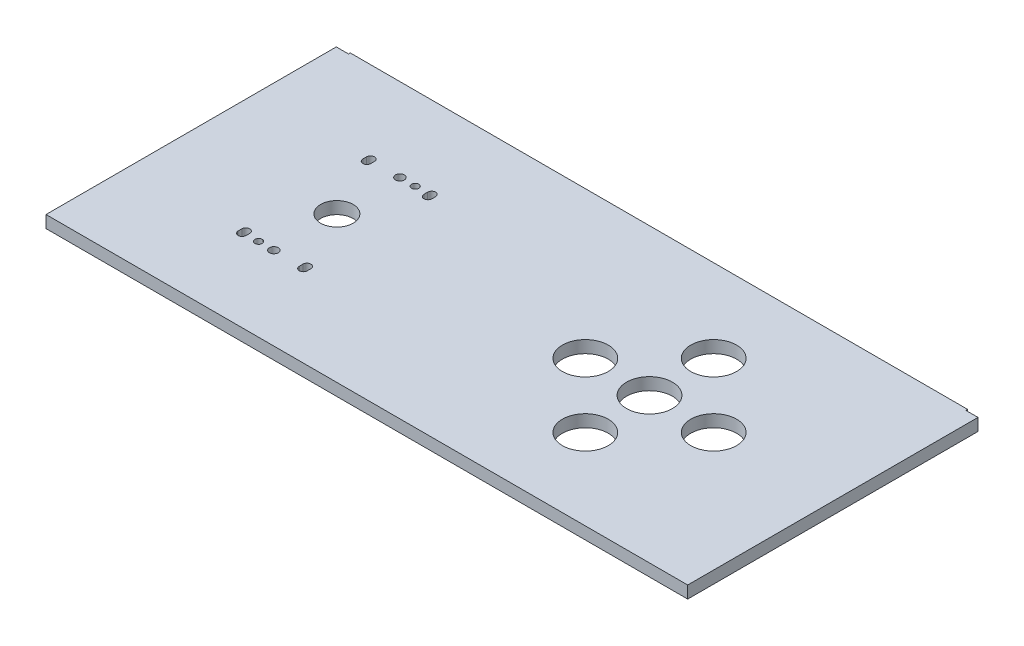
ISO-10303-21;
HEADER;
FILE_DESCRIPTION(('STEP AP214'),'2;1');
FILE_NAME('part.step','',(''),(''),'','','');
FILE_SCHEMA(('AUTOMOTIVE_DESIGN { 1 0 10303 214 1 1 1 1 }'));
ENDSEC;
DATA;
#1=APPLICATION_CONTEXT('core data for automotive mechanical design processes');
#2=APPLICATION_PROTOCOL_DEFINITION('international standard','automotive_design',2000,#1);
#3=PRODUCT_CONTEXT('',#1,'mechanical');
#4=PRODUCT('Part','Part','',(#3));
#5=PRODUCT_RELATED_PRODUCT_CATEGORY('part','',(#4));
#6=PRODUCT_DEFINITION_FORMATION('','',#4);
#7=PRODUCT_DEFINITION_CONTEXT('part definition',#1,'design');
#8=PRODUCT_DEFINITION('design','',#6,#7);
#9=PRODUCT_DEFINITION_SHAPE('','',#8);
#10=(LENGTH_UNIT() NAMED_UNIT(*) SI_UNIT(.MILLI.,.METRE.));
#11=(NAMED_UNIT(*) PLANE_ANGLE_UNIT() SI_UNIT($,.RADIAN.));
#12=(NAMED_UNIT(*) SI_UNIT($,.STERADIAN.) SOLID_ANGLE_UNIT());
#13=UNCERTAINTY_MEASURE_WITH_UNIT(LENGTH_MEASURE(1.E-05),#10,'distance_accuracy_value','');
#14=(GEOMETRIC_REPRESENTATION_CONTEXT(3) GLOBAL_UNCERTAINTY_ASSIGNED_CONTEXT((#13)) GLOBAL_UNIT_ASSIGNED_CONTEXT((#10,
#11,#12)) REPRESENTATION_CONTEXT('',''));
#15=CARTESIAN_POINT('',(0.,0.,0.));
#16=DIRECTION('',(0.,0.,1.));
#17=DIRECTION('',(1.,0.,0.));
#18=AXIS2_PLACEMENT_3D('',#15,#16,#17);
#19=CARTESIAN_POINT('',(114.80943427695,8.,-137.577360592451));
#20=DIRECTION('',(0.,-1.,0.));
#21=DIRECTION('',(0.,0.,-1.));
#22=AXIS2_PLACEMENT_3D('',#19,#20,#21);
#23=CYLINDRICAL_SURFACE('',#22,2.6);
#24=CARTESIAN_POINT('',(114.80943427695,0.,-137.577360592451));
#25=DIRECTION('',(0.,1.,0.));
#26=DIRECTION('',(0.,0.,1.));
#27=AXIS2_PLACEMENT_3D('',#24,#25,#26);
#28=CIRCLE('',#27,2.6);
#29=CARTESIAN_POINT('',(117.40943427695,0.,-137.577360592451));
#30=VERTEX_POINT('',#29);
#31=CARTESIAN_POINT('',(112.20943427695,0.,-137.577360592451));
#32=VERTEX_POINT('',#31);
#33=EDGE_CURVE('E321',#30,#32,#28,.T.);
#34=ORIENTED_EDGE('',*,*,#33,.F.);
#35=DIRECTION('',(0.,-1.,0.));
#36=VECTOR('',#35,1.);
#37=CARTESIAN_POINT('',(117.40943427695,8.,-137.577360592451));
#38=LINE('',#37,#36);
#39=CARTESIAN_POINT('',(117.40943427695,8.,-137.577360592451));
#40=VERTEX_POINT('',#39);
#41=EDGE_CURVE('E11',#40,#30,#38,.T.);
#42=ORIENTED_EDGE('',*,*,#41,.F.);
#43=CARTESIAN_POINT('',(114.80943427695,8.,-137.577360592451));
#44=DIRECTION('',(0.,1.,0.));
#45=DIRECTION('',(0.,0.,1.));
#46=AXIS2_PLACEMENT_3D('',#43,#44,#45);
#47=CIRCLE('',#46,2.6);
#48=CARTESIAN_POINT('',(112.20943427695,8.,-137.577360592451));
#49=VERTEX_POINT('',#48);
#50=EDGE_CURVE('E226',#40,#49,#47,.T.);
#51=ORIENTED_EDGE('',*,*,#50,.T.);
#52=DIRECTION('',(0.,-1.,0.));
#53=VECTOR('',#52,1.);
#54=CARTESIAN_POINT('',(112.20943427695,8.,-137.577360592451));
#55=LINE('',#54,#53);
#56=EDGE_CURVE('E60',#49,#32,#55,.T.);
#57=ORIENTED_EDGE('',*,*,#56,.T.);
#58=EDGE_LOOP('',(#34,#42,#51,#57));
#59=FACE_BOUND('',#58,.T.);
#60=ADVANCED_FACE('F41',(#59),#23,.F.);
#61=CARTESIAN_POINT('',(117.409434276951,8.,-6.78909673137948E-13));
#62=DIRECTION('',(-1.,0.,0.));
#63=DIRECTION('',(0.,0.,1.));
#64=AXIS2_PLACEMENT_3D('',#61,#62,#63);
#65=PLANE('',#64);
#66=DIRECTION('',(0.,0.,-1.));
#67=VECTOR('',#66,1.);
#68=CARTESIAN_POINT('',(117.409434276951,0.,-6.78909673137948E-13));
#69=LINE('',#68,#67);
#70=CARTESIAN_POINT('',(117.40943427695,0.,-135.177360592451));
#71=VERTEX_POINT('',#70);
#72=EDGE_CURVE('E214',#71,#30,#69,.T.);
#73=ORIENTED_EDGE('',*,*,#72,.F.);
#74=DIRECTION('',(0.,-1.,0.));
#75=VECTOR('',#74,1.);
#76=CARTESIAN_POINT('',(117.40943427695,8.,-135.177360592451));
#77=LINE('',#76,#75);
#78=CARTESIAN_POINT('',(117.40943427695,8.,-135.177360592451));
#79=VERTEX_POINT('',#78);
#80=EDGE_CURVE('E51',#79,#71,#77,.T.);
#81=ORIENTED_EDGE('',*,*,#80,.F.);
#82=DIRECTION('',(0.,0.,-1.));
#83=VECTOR('',#82,1.);
#84=CARTESIAN_POINT('',(117.409434276951,8.,-6.78909673137948E-13));
#85=LINE('',#84,#83);
#86=EDGE_CURVE('E212',#79,#40,#85,.T.);
#87=ORIENTED_EDGE('',*,*,#86,.T.);
#88=ORIENTED_EDGE('',*,*,#41,.T.);
#89=EDGE_LOOP('',(#73,#81,#87,#88));
#90=FACE_BOUND('',#89,.T.);
#91=ADVANCED_FACE('F211',(#90),#65,.T.);
#92=CARTESIAN_POINT('',(114.80943427695,8.,-135.177360592451));
#93=DIRECTION('',(0.,-1.,0.));
#94=DIRECTION('',(0.,0.,-1.));
#95=AXIS2_PLACEMENT_3D('',#92,#93,#94);
#96=CYLINDRICAL_SURFACE('',#95,2.6);
#97=CARTESIAN_POINT('',(114.80943427695,0.,-135.177360592451));
#98=DIRECTION('',(0.,1.,0.));
#99=DIRECTION('',(0.,0.,1.));
#100=AXIS2_PLACEMENT_3D('',#97,#98,#99);
#101=CIRCLE('',#100,2.6);
#102=CARTESIAN_POINT('',(112.20943427695,0.,-135.177360592451));
#103=VERTEX_POINT('',#102);
#104=EDGE_CURVE('E324',#103,#71,#101,.T.);
#105=ORIENTED_EDGE('',*,*,#104,.F.);
#106=DIRECTION('',(0.,-1.,0.));
#107=VECTOR('',#106,1.);
#108=CARTESIAN_POINT('',(112.20943427695,8.,-135.177360592451));
#109=LINE('',#108,#107);
#110=CARTESIAN_POINT('',(112.20943427695,8.,-135.177360592451));
#111=VERTEX_POINT('',#110);
#112=EDGE_CURVE('E133',#111,#103,#109,.T.);
#113=ORIENTED_EDGE('',*,*,#112,.F.);
#114=CARTESIAN_POINT('',(114.80943427695,8.,-135.177360592451));
#115=DIRECTION('',(0.,1.,0.));
#116=DIRECTION('',(0.,0.,1.));
#117=AXIS2_PLACEMENT_3D('',#114,#115,#116);
#118=CIRCLE('',#117,2.6);
#119=EDGE_CURVE('E225',#111,#79,#118,.T.);
#120=ORIENTED_EDGE('',*,*,#119,.T.);
#121=ORIENTED_EDGE('',*,*,#80,.T.);
#122=EDGE_LOOP('',(#105,#113,#120,#121));
#123=FACE_BOUND('',#122,.T.);
#124=ADVANCED_FACE('F228',(#123),#96,.F.);
#125=CARTESIAN_POINT('',(114.80943427695,8.,-55.9773605924511));
#126=DIRECTION('',(0.,-1.,0.));
#127=DIRECTION('',(0.,0.,-1.));
#128=AXIS2_PLACEMENT_3D('',#125,#126,#127);
#129=CYLINDRICAL_SURFACE('',#128,2.6);
#130=CARTESIAN_POINT('',(114.80943427695,0.,-55.9773605924511));
#131=DIRECTION('',(0.,1.,0.));
#132=DIRECTION('',(0.,0.,1.));
#133=AXIS2_PLACEMENT_3D('',#130,#131,#132);
#134=CIRCLE('',#133,2.6);
#135=CARTESIAN_POINT('',(117.40943427695,0.,-55.9773605924511));
#136=VERTEX_POINT('',#135);
#137=CARTESIAN_POINT('',(112.20943427695,0.,-55.9773605924511));
#138=VERTEX_POINT('',#137);
#139=EDGE_CURVE('E309',#136,#138,#134,.T.);
#140=ORIENTED_EDGE('',*,*,#139,.F.);
#141=DIRECTION('',(0.,-1.,0.));
#142=VECTOR('',#141,1.);
#143=CARTESIAN_POINT('',(117.40943427695,8.,-55.9773605924511));
#144=LINE('',#143,#142);
#145=CARTESIAN_POINT('',(117.40943427695,8.,-55.9773605924511));
#146=VERTEX_POINT('',#145);
#147=EDGE_CURVE('E346',#146,#136,#144,.T.);
#148=ORIENTED_EDGE('',*,*,#147,.F.);
#149=CARTESIAN_POINT('',(114.80943427695,8.,-55.9773605924511));
#150=DIRECTION('',(0.,1.,0.));
#151=DIRECTION('',(0.,0.,1.));
#152=AXIS2_PLACEMENT_3D('',#149,#150,#151);
#153=CIRCLE('',#152,2.6);
#154=CARTESIAN_POINT('',(112.20943427695,8.,-55.9773605924511));
#155=VERTEX_POINT('',#154);
#156=EDGE_CURVE('E462',#146,#155,#153,.T.);
#157=ORIENTED_EDGE('',*,*,#156,.T.);
#158=DIRECTION('',(0.,-1.,0.));
#159=VECTOR('',#158,1.);
#160=CARTESIAN_POINT('',(112.20943427695,8.,-55.9773605924511));
#161=LINE('',#160,#159);
#162=EDGE_CURVE('E348',#155,#138,#161,.T.);
#163=ORIENTED_EDGE('',*,*,#162,.T.);
#164=EDGE_LOOP('',(#140,#148,#157,#163));
#165=FACE_BOUND('',#164,.T.);
#166=ADVANCED_FACE('F504',(#165),#129,.F.);
#167=CARTESIAN_POINT('',(117.409434276951,8.,-6.78909673137941E-13));
#168=DIRECTION('',(-1.,0.,0.));
#169=DIRECTION('',(0.,0.,1.));
#170=AXIS2_PLACEMENT_3D('',#167,#168,#169);
#171=PLANE('',#170);
#172=DIRECTION('',(0.,0.,-1.));
#173=VECTOR('',#172,1.);
#174=CARTESIAN_POINT('',(117.409434276951,0.,-6.78909673137941E-13));
#175=LINE('',#174,#173);
#176=CARTESIAN_POINT('',(117.40943427695,0.,-53.5773605924511));
#177=VERTEX_POINT('',#176);
#178=EDGE_CURVE('E312',#177,#136,#175,.T.);
#179=ORIENTED_EDGE('',*,*,#178,.F.);
#180=DIRECTION('',(0.,-1.,0.));
#181=VECTOR('',#180,1.);
#182=CARTESIAN_POINT('',(117.40943427695,8.,-53.5773605924511));
#183=LINE('',#182,#181);
#184=CARTESIAN_POINT('',(117.40943427695,8.,-53.5773605924511));
#185=VERTEX_POINT('',#184);
#186=EDGE_CURVE('E353',#185,#177,#183,.T.);
#187=ORIENTED_EDGE('',*,*,#186,.F.);
#188=DIRECTION('',(0.,0.,-1.));
#189=VECTOR('',#188,1.);
#190=CARTESIAN_POINT('',(117.409434276951,8.,-6.78909673137941E-13));
#191=LINE('',#190,#189);
#192=EDGE_CURVE('E465',#185,#146,#191,.T.);
#193=ORIENTED_EDGE('',*,*,#192,.T.);
#194=ORIENTED_EDGE('',*,*,#147,.T.);
#195=EDGE_LOOP('',(#179,#187,#193,#194));
#196=FACE_BOUND('',#195,.T.);
#197=ADVANCED_FACE('F500',(#196),#171,.T.);
#198=CARTESIAN_POINT('',(114.80943427695,8.,-53.5773605924511));
#199=DIRECTION('',(0.,-1.,0.));
#200=DIRECTION('',(0.,0.,-1.));
#201=AXIS2_PLACEMENT_3D('',#198,#199,#200);
#202=CYLINDRICAL_SURFACE('',#201,2.6);
#203=CARTESIAN_POINT('',(114.80943427695,0.,-53.5773605924511));
#204=DIRECTION('',(0.,1.,0.));
#205=DIRECTION('',(0.,0.,1.));
#206=AXIS2_PLACEMENT_3D('',#203,#204,#205);
#207=CIRCLE('',#206,2.6);
#208=CARTESIAN_POINT('',(112.20943427695,0.,-53.5773605924511));
#209=VERTEX_POINT('',#208);
#210=EDGE_CURVE('E315',#209,#177,#207,.T.);
#211=ORIENTED_EDGE('',*,*,#210,.F.);
#212=DIRECTION('',(0.,-1.,0.));
#213=VECTOR('',#212,1.);
#214=CARTESIAN_POINT('',(112.20943427695,8.,-53.5773605924511));
#215=LINE('',#214,#213);
#216=CARTESIAN_POINT('',(112.20943427695,8.,-53.5773605924511));
#217=VERTEX_POINT('',#216);
#218=EDGE_CURVE('E350',#217,#209,#215,.T.);
#219=ORIENTED_EDGE('',*,*,#218,.F.);
#220=CARTESIAN_POINT('',(114.80943427695,8.,-53.5773605924511));
#221=DIRECTION('',(0.,1.,0.));
#222=DIRECTION('',(0.,0.,1.));
#223=AXIS2_PLACEMENT_3D('',#220,#221,#222);
#224=CIRCLE('',#223,2.6);
#225=EDGE_CURVE('E468',#217,#185,#224,.T.);
#226=ORIENTED_EDGE('',*,*,#225,.T.);
#227=ORIENTED_EDGE('',*,*,#186,.T.);
#228=EDGE_LOOP('',(#211,#219,#226,#227));
#229=FACE_BOUND('',#228,.T.);
#230=ADVANCED_FACE('F496',(#229),#202,.F.);
#231=CARTESIAN_POINT('',(74.8094342769504,8.,-53.5773605924512));
#232=DIRECTION('',(0.,-1.,0.));
#233=DIRECTION('',(0.,0.,-1.));
#234=AXIS2_PLACEMENT_3D('',#231,#232,#233);
#235=CYLINDRICAL_SURFACE('',#234,2.6);
#236=CARTESIAN_POINT('',(74.8094342769504,0.,-53.5773605924512));
#237=DIRECTION('',(0.,1.,0.));
#238=DIRECTION('',(0.,0.,1.));
#239=AXIS2_PLACEMENT_3D('',#236,#237,#238);
#240=CIRCLE('',#239,2.6);
#241=CARTESIAN_POINT('',(72.2094342769504,0.,-53.5773605924512));
#242=VERTEX_POINT('',#241);
#243=CARTESIAN_POINT('',(77.4094342769504,0.,-53.5773605924512));
#244=VERTEX_POINT('',#243);
#245=EDGE_CURVE('E297',#242,#244,#240,.T.);
#246=ORIENTED_EDGE('',*,*,#245,.F.);
#247=DIRECTION('',(0.,-1.,0.));
#248=VECTOR('',#247,1.);
#249=CARTESIAN_POINT('',(72.2094342769504,8.,-53.5773605924512));
#250=LINE('',#249,#248);
#251=CARTESIAN_POINT('',(72.2094342769504,8.,-53.5773605924512));
#252=VERTEX_POINT('',#251);
#253=EDGE_CURVE('E351',#252,#242,#250,.T.);
#254=ORIENTED_EDGE('',*,*,#253,.F.);
#255=CARTESIAN_POINT('',(74.8094342769504,8.,-53.5773605924512));
#256=DIRECTION('',(0.,1.,0.));
#257=DIRECTION('',(0.,0.,1.));
#258=AXIS2_PLACEMENT_3D('',#255,#256,#257);
#259=CIRCLE('',#258,2.6);
#260=CARTESIAN_POINT('',(77.4094342769504,8.,-53.5773605924512));
#261=VERTEX_POINT('',#260);
#262=EDGE_CURVE('E450',#252,#261,#259,.T.);
#263=ORIENTED_EDGE('',*,*,#262,.T.);
#264=DIRECTION('',(0.,-1.,0.));
#265=VECTOR('',#264,1.);
#266=CARTESIAN_POINT('',(77.4094342769504,8.,-53.5773605924512));
#267=LINE('',#266,#265);
#268=EDGE_CURVE('E356',#261,#244,#267,.T.);
#269=ORIENTED_EDGE('',*,*,#268,.T.);
#270=EDGE_LOOP('',(#246,#254,#263,#269));
#271=FACE_BOUND('',#270,.T.);
#272=ADVANCED_FACE('F499',(#271),#235,.F.);
#273=CARTESIAN_POINT('',(72.2094342769507,8.,-4.17544669424102E-13));
#274=DIRECTION('',(1.,0.,0.));
#275=DIRECTION('',(0.,0.,-1.));
#276=AXIS2_PLACEMENT_3D('',#273,#274,#275);
#277=PLANE('',#276);
#278=DIRECTION('',(0.,0.,1.));
#279=VECTOR('',#278,1.);
#280=CARTESIAN_POINT('',(72.2094342769507,0.,-4.17544669424102E-13));
#281=LINE('',#280,#279);
#282=CARTESIAN_POINT('',(72.2094342769504,0.,-55.9773605924512));
#283=VERTEX_POINT('',#282);
#284=EDGE_CURVE('E300',#283,#242,#281,.T.);
#285=ORIENTED_EDGE('',*,*,#284,.F.);
#286=DIRECTION('',(0.,-1.,0.));
#287=VECTOR('',#286,1.);
#288=CARTESIAN_POINT('',(72.2094342769504,8.,-55.9773605924512));
#289=LINE('',#288,#287);
#290=CARTESIAN_POINT('',(72.2094342769504,8.,-55.9773605924512));
#291=VERTEX_POINT('',#290);
#292=EDGE_CURVE('E361',#291,#283,#289,.T.);
#293=ORIENTED_EDGE('',*,*,#292,.F.);
#294=DIRECTION('',(0.,0.,1.));
#295=VECTOR('',#294,1.);
#296=CARTESIAN_POINT('',(72.2094342769507,8.,-4.17544669424102E-13));
#297=LINE('',#296,#295);
#298=EDGE_CURVE('E453',#291,#252,#297,.T.);
#299=ORIENTED_EDGE('',*,*,#298,.T.);
#300=ORIENTED_EDGE('',*,*,#253,.T.);
#301=EDGE_LOOP('',(#285,#293,#299,#300));
#302=FACE_BOUND('',#301,.T.);
#303=ADVANCED_FACE('F517',(#302),#277,.T.);
#304=CARTESIAN_POINT('',(74.8094342769504,8.,-55.9773605924512));
#305=DIRECTION('',(0.,-1.,0.));
#306=DIRECTION('',(0.,0.,-1.));
#307=AXIS2_PLACEMENT_3D('',#304,#305,#306);
#308=CYLINDRICAL_SURFACE('',#307,2.6);
#309=CARTESIAN_POINT('',(74.8094342769504,0.,-55.9773605924512));
#310=DIRECTION('',(0.,1.,0.));
#311=DIRECTION('',(0.,0.,1.));
#312=AXIS2_PLACEMENT_3D('',#309,#310,#311);
#313=CIRCLE('',#312,2.6);
#314=CARTESIAN_POINT('',(77.4094342769504,0.,-55.9773605924512));
#315=VERTEX_POINT('',#314);
#316=EDGE_CURVE('E303',#315,#283,#313,.T.);
#317=ORIENTED_EDGE('',*,*,#316,.F.);
#318=DIRECTION('',(0.,-1.,0.));
#319=VECTOR('',#318,1.);
#320=CARTESIAN_POINT('',(77.4094342769504,8.,-55.9773605924512));
#321=LINE('',#320,#319);
#322=CARTESIAN_POINT('',(77.4094342769504,8.,-55.9773605924512));
#323=VERTEX_POINT('',#322);
#324=EDGE_CURVE('E358',#323,#315,#321,.T.);
#325=ORIENTED_EDGE('',*,*,#324,.F.);
#326=CARTESIAN_POINT('',(74.8094342769504,8.,-55.9773605924512));
#327=DIRECTION('',(0.,1.,0.));
#328=DIRECTION('',(0.,0.,1.));
#329=AXIS2_PLACEMENT_3D('',#326,#327,#328);
#330=CIRCLE('',#329,2.6);
#331=EDGE_CURVE('E456',#323,#291,#330,.T.);
#332=ORIENTED_EDGE('',*,*,#331,.T.);
#333=ORIENTED_EDGE('',*,*,#292,.T.);
#334=EDGE_LOOP('',(#317,#325,#332,#333));
#335=FACE_BOUND('',#334,.T.);
#336=ADVANCED_FACE('F513',(#335),#308,.F.);
#337=CARTESIAN_POINT('',(74.8094342769504,8.,-135.177360592451));
#338=DIRECTION('',(0.,-1.,0.));
#339=DIRECTION('',(0.,0.,-1.));
#340=AXIS2_PLACEMENT_3D('',#337,#338,#339);
#341=CYLINDRICAL_SURFACE('',#340,2.6);
#342=CARTESIAN_POINT('',(74.8094342769504,0.,-135.177360592451));
#343=DIRECTION('',(0.,1.,0.));
#344=DIRECTION('',(0.,0.,1.));
#345=AXIS2_PLACEMENT_3D('',#342,#343,#344);
#346=CIRCLE('',#345,2.6);
#347=CARTESIAN_POINT('',(72.2094342769504,0.,-135.177360592451));
#348=VERTEX_POINT('',#347);
#349=CARTESIAN_POINT('',(77.4094342769504,0.,-135.177360592451));
#350=VERTEX_POINT('',#349);
#351=EDGE_CURVE('E285',#348,#350,#346,.T.);
#352=ORIENTED_EDGE('',*,*,#351,.F.);
#353=DIRECTION('',(0.,-1.,0.));
#354=VECTOR('',#353,1.);
#355=CARTESIAN_POINT('',(72.2094342769504,8.,-135.177360592451));
#356=LINE('',#355,#354);
#357=CARTESIAN_POINT('',(72.2094342769504,8.,-135.177360592451));
#358=VERTEX_POINT('',#357);
#359=EDGE_CURVE('E359',#358,#348,#356,.T.);
#360=ORIENTED_EDGE('',*,*,#359,.F.);
#361=CARTESIAN_POINT('',(74.8094342769504,8.,-135.177360592451));
#362=DIRECTION('',(0.,1.,0.));
#363=DIRECTION('',(0.,0.,1.));
#364=AXIS2_PLACEMENT_3D('',#361,#362,#363);
#365=CIRCLE('',#364,2.6);
#366=CARTESIAN_POINT('',(77.4094342769504,8.,-135.177360592451));
#367=VERTEX_POINT('',#366);
#368=EDGE_CURVE('E438',#358,#367,#365,.T.);
#369=ORIENTED_EDGE('',*,*,#368,.T.);
#370=DIRECTION('',(0.,-1.,0.));
#371=VECTOR('',#370,1.);
#372=CARTESIAN_POINT('',(77.4094342769504,8.,-135.177360592451));
#373=LINE('',#372,#371);
#374=EDGE_CURVE('E364',#367,#350,#373,.T.);
#375=ORIENTED_EDGE('',*,*,#374,.T.);
#376=EDGE_LOOP('',(#352,#360,#369,#375));
#377=FACE_BOUND('',#376,.T.);
#378=ADVANCED_FACE('F516',(#377),#341,.F.);
#379=CARTESIAN_POINT('',(72.2094342769512,8.,-4.17544669424108E-13));
#380=DIRECTION('',(1.,0.,0.));
#381=DIRECTION('',(0.,0.,-1.));
#382=AXIS2_PLACEMENT_3D('',#379,#380,#381);
#383=PLANE('',#382);
#384=DIRECTION('',(0.,0.,1.));
#385=VECTOR('',#384,1.);
#386=CARTESIAN_POINT('',(72.2094342769512,0.,-4.17544669424108E-13));
#387=LINE('',#386,#385);
#388=CARTESIAN_POINT('',(72.2094342769504,0.,-137.577360592451));
#389=VERTEX_POINT('',#388);
#390=EDGE_CURVE('E288',#389,#348,#387,.T.);
#391=ORIENTED_EDGE('',*,*,#390,.F.);
#392=DIRECTION('',(0.,-1.,0.));
#393=VECTOR('',#392,1.);
#394=CARTESIAN_POINT('',(72.2094342769504,8.,-137.577360592451));
#395=LINE('',#394,#393);
#396=CARTESIAN_POINT('',(72.2094342769504,8.,-137.577360592451));
#397=VERTEX_POINT('',#396);
#398=EDGE_CURVE('E368',#397,#389,#395,.T.);
#399=ORIENTED_EDGE('',*,*,#398,.F.);
#400=DIRECTION('',(0.,0.,1.));
#401=VECTOR('',#400,1.);
#402=CARTESIAN_POINT('',(72.2094342769512,8.,-4.17544669424108E-13));
#403=LINE('',#402,#401);
#404=EDGE_CURVE('E441',#397,#358,#403,.T.);
#405=ORIENTED_EDGE('',*,*,#404,.T.);
#406=ORIENTED_EDGE('',*,*,#359,.T.);
#407=EDGE_LOOP('',(#391,#399,#405,#406));
#408=FACE_BOUND('',#407,.T.);
#409=ADVANCED_FACE('F532',(#408),#383,.T.);
#410=CARTESIAN_POINT('',(74.8094342769504,8.,-137.577360592451));
#411=DIRECTION('',(0.,-1.,0.));
#412=DIRECTION('',(0.,0.,-1.));
#413=AXIS2_PLACEMENT_3D('',#410,#411,#412);
#414=CYLINDRICAL_SURFACE('',#413,2.6);
#415=CARTESIAN_POINT('',(74.8094342769504,0.,-137.577360592451));
#416=DIRECTION('',(0.,1.,0.));
#417=DIRECTION('',(0.,0.,1.));
#418=AXIS2_PLACEMENT_3D('',#415,#416,#417);
#419=CIRCLE('',#418,2.6);
#420=CARTESIAN_POINT('',(77.4094342769504,0.,-137.577360592451));
#421=VERTEX_POINT('',#420);
#422=EDGE_CURVE('E291',#421,#389,#419,.T.);
#423=ORIENTED_EDGE('',*,*,#422,.F.);
#424=DIRECTION('',(0.,-1.,0.));
#425=VECTOR('',#424,1.);
#426=CARTESIAN_POINT('',(77.4094342769504,8.,-137.577360592451));
#427=LINE('',#426,#425);
#428=CARTESIAN_POINT('',(77.4094342769504,8.,-137.577360592451));
#429=VERTEX_POINT('',#428);
#430=EDGE_CURVE('E366',#429,#421,#427,.T.);
#431=ORIENTED_EDGE('',*,*,#430,.F.);
#432=CARTESIAN_POINT('',(74.8094342769504,8.,-137.577360592451));
#433=DIRECTION('',(0.,1.,0.));
#434=DIRECTION('',(0.,0.,1.));
#435=AXIS2_PLACEMENT_3D('',#432,#433,#434);
#436=CIRCLE('',#435,2.6);
#437=EDGE_CURVE('E444',#429,#397,#436,.T.);
#438=ORIENTED_EDGE('',*,*,#437,.T.);
#439=ORIENTED_EDGE('',*,*,#398,.T.);
#440=EDGE_LOOP('',(#423,#431,#438,#439));
#441=FACE_BOUND('',#440,.T.);
#442=ADVANCED_FACE('F529',(#441),#414,.F.);
#443=CARTESIAN_POINT('',(0.,8.,-191.154701828785));
#444=DIRECTION('',(0.,0.,1.));
#445=DIRECTION('',(1.,0.,0.));
#446=AXIS2_PLACEMENT_3D('',#443,#444,#445);
#447=PLANE('',#446);
#448=DIRECTION('',(-1.,0.,0.));
#449=VECTOR('',#448,1.);
#450=CARTESIAN_POINT('',(0.,0.,-191.154701828785));
#451=LINE('',#450,#449);
#452=CARTESIAN_POINT('',(412.,0.,-191.154701828785));
#453=VERTEX_POINT('',#452);
#454=CARTESIAN_POINT('',(8.,0.,-191.154701828785));
#455=VERTEX_POINT('',#454);
#456=EDGE_CURVE('E250',#453,#455,#451,.T.);
#457=ORIENTED_EDGE('',*,*,#456,.T.);
#458=DIRECTION('',(0.,-1.,0.));
#459=VECTOR('',#458,1.);
#460=CARTESIAN_POINT('',(8.,8.,-191.154701828785));
#461=LINE('',#460,#459);
#462=CARTESIAN_POINT('',(8.,8.,-191.154701828785));
#463=VERTEX_POINT('',#462);
#464=EDGE_CURVE('E45',#463,#455,#461,.T.);
#465=ORIENTED_EDGE('',*,*,#464,.F.);
#466=DIRECTION('',(-1.,0.,0.));
#467=VECTOR('',#466,1.);
#468=CARTESIAN_POINT('',(0.,8.,-191.154701828785));
#469=LINE('',#468,#467);
#470=CARTESIAN_POINT('',(412.,8.,-191.154701828785));
#471=VERTEX_POINT('',#470);
#472=EDGE_CURVE('E344',#471,#463,#469,.T.);
#473=ORIENTED_EDGE('',*,*,#472,.F.);
#474=DIRECTION('',(0.,-1.,0.));
#475=VECTOR('',#474,1.);
#476=CARTESIAN_POINT('',(412.,8.,-191.154701828785));
#477=LINE('',#476,#475);
#478=EDGE_CURVE('E249',#471,#453,#477,.T.);
#479=ORIENTED_EDGE('',*,*,#478,.T.);
#480=EDGE_LOOP('',(#457,#465,#473,#479));
#481=FACE_BOUND('',#480,.T.);
#482=ADVANCED_FACE('F43',(#481),#447,.F.);
#483=CARTESIAN_POINT('',(8.,8.,0.));
#484=DIRECTION('',(1.,0.,0.));
#485=DIRECTION('',(0.,0.,-1.));
#486=AXIS2_PLACEMENT_3D('',#483,#484,#485);
#487=PLANE('',#486);
#488=DIRECTION('',(0.,0.,1.));
#489=VECTOR('',#488,1.);
#490=CARTESIAN_POINT('',(8.,0.,0.));
#491=LINE('',#490,#489);
#492=CARTESIAN_POINT('',(8.,0.,-190.));
#493=VERTEX_POINT('',#492);
#494=EDGE_CURVE('E253',#455,#493,#491,.T.);
#495=ORIENTED_EDGE('',*,*,#494,.T.);
#496=DIRECTION('',(0.,-1.,0.));
#497=VECTOR('',#496,1.);
#498=CARTESIAN_POINT('',(8.,8.,-190.));
#499=LINE('',#498,#497);
#500=CARTESIAN_POINT('',(8.,8.,-190.));
#501=VERTEX_POINT('',#500);
#502=EDGE_CURVE('E383',#501,#493,#499,.T.);
#503=ORIENTED_EDGE('',*,*,#502,.F.);
#504=DIRECTION('',(0.,0.,1.));
#505=VECTOR('',#504,1.);
#506=CARTESIAN_POINT('',(8.,8.,0.));
#507=LINE('',#506,#505);
#508=EDGE_CURVE('E146',#463,#501,#507,.T.);
#509=ORIENTED_EDGE('',*,*,#508,.F.);
#510=ORIENTED_EDGE('',*,*,#464,.T.);
#511=EDGE_LOOP('',(#495,#503,#509,#510));
#512=FACE_BOUND('',#511,.T.);
#513=ADVANCED_FACE('F388',(#512),#487,.F.);
#514=CARTESIAN_POINT('',(0.,8.,-190.));
#515=DIRECTION('',(0.,0.,-1.));
#516=DIRECTION('',(-1.,0.,0.));
#517=AXIS2_PLACEMENT_3D('',#514,#515,#516);
#518=PLANE('',#517);
#519=DIRECTION('',(1.,0.,0.));
#520=VECTOR('',#519,1.);
#521=CARTESIAN_POINT('',(0.,0.,-190.));
#522=LINE('',#521,#520);
#523=CARTESIAN_POINT('',(0.,0.,-190.));
#524=VERTEX_POINT('',#523);
#525=EDGE_CURVE('E256',#524,#493,#522,.T.);
#526=ORIENTED_EDGE('',*,*,#525,.F.);
#527=DIRECTION('',(0.,-1.,0.));
#528=VECTOR('',#527,1.);
#529=CARTESIAN_POINT('',(0.,8.,-190.));
#530=LINE('',#529,#528);
#531=CARTESIAN_POINT('',(0.,8.,-190.));
#532=VERTEX_POINT('',#531);
#533=EDGE_CURVE('E382',#532,#524,#530,.T.);
#534=ORIENTED_EDGE('',*,*,#533,.F.);
#535=DIRECTION('',(1.,0.,0.));
#536=VECTOR('',#535,1.);
#537=CARTESIAN_POINT('',(0.,8.,-190.));
#538=LINE('',#537,#536);
#539=EDGE_CURVE('E403',#532,#501,#538,.T.);
#540=ORIENTED_EDGE('',*,*,#539,.T.);
#541=ORIENTED_EDGE('',*,*,#502,.T.);
#542=EDGE_LOOP('',(#526,#534,#540,#541));
#543=FACE_BOUND('',#542,.T.);
#544=ADVANCED_FACE('F401',(#543),#518,.T.);
#545=CARTESIAN_POINT('',(0.,8.,0.));
#546=DIRECTION('',(-1.,0.,0.));
#547=DIRECTION('',(0.,0.,1.));
#548=AXIS2_PLACEMENT_3D('',#545,#546,#547);
#549=PLANE('',#548);
#550=DIRECTION('',(0.,0.,-1.));
#551=VECTOR('',#550,1.);
#552=CARTESIAN_POINT('',(0.,0.,0.));
#553=LINE('',#552,#551);
#554=CARTESIAN_POINT('',(0.,0.,0.));
#555=VERTEX_POINT('',#554);
#556=EDGE_CURVE('E259',#555,#524,#553,.T.);
#557=ORIENTED_EDGE('',*,*,#556,.F.);
#558=DIRECTION('',(0.,-1.,0.));
#559=VECTOR('',#558,1.);
#560=CARTESIAN_POINT('',(0.,8.,0.));
#561=LINE('',#560,#559);
#562=CARTESIAN_POINT('',(0.,8.,0.));
#563=VERTEX_POINT('',#562);
#564=EDGE_CURVE('E380',#563,#555,#561,.T.);
#565=ORIENTED_EDGE('',*,*,#564,.F.);
#566=DIRECTION('',(0.,0.,-1.));
#567=VECTOR('',#566,1.);
#568=CARTESIAN_POINT('',(0.,8.,0.));
#569=LINE('',#568,#567);
#570=EDGE_CURVE('E409',#563,#532,#569,.T.);
#571=ORIENTED_EDGE('',*,*,#570,.T.);
#572=ORIENTED_EDGE('',*,*,#533,.T.);
#573=EDGE_LOOP('',(#557,#565,#571,#572));
#574=FACE_BOUND('',#573,.T.);
#575=ADVANCED_FACE('F412',(#574),#549,.T.);
#576=CARTESIAN_POINT('',(0.,8.,0.));
#577=DIRECTION('',(0.,0.,-1.));
#578=DIRECTION('',(-1.,0.,0.));
#579=AXIS2_PLACEMENT_3D('',#576,#577,#578);
#580=PLANE('',#579);
#581=DIRECTION('',(1.,0.,0.));
#582=VECTOR('',#581,1.);
#583=CARTESIAN_POINT('',(0.,0.,0.));
#584=LINE('',#583,#582);
#585=CARTESIAN_POINT('',(420.,0.,0.));
#586=VERTEX_POINT('',#585);
#587=EDGE_CURVE('E263',#555,#586,#584,.T.);
#588=ORIENTED_EDGE('',*,*,#587,.T.);
#589=DIRECTION('',(0.,-1.,0.));
#590=VECTOR('',#589,1.);
#591=CARTESIAN_POINT('',(420.,8.,0.));
#592=LINE('',#591,#590);
#593=CARTESIAN_POINT('',(420.,8.,0.));
#594=VERTEX_POINT('',#593);
#595=EDGE_CURVE('E377',#594,#586,#592,.T.);
#596=ORIENTED_EDGE('',*,*,#595,.F.);
#597=DIRECTION('',(1.,0.,0.));
#598=VECTOR('',#597,1.);
#599=CARTESIAN_POINT('',(0.,8.,0.));
#600=LINE('',#599,#598);
#601=EDGE_CURVE('E414',#563,#594,#600,.T.);
#602=ORIENTED_EDGE('',*,*,#601,.F.);
#603=ORIENTED_EDGE('',*,*,#564,.T.);
#604=EDGE_LOOP('',(#588,#596,#602,#603));
#605=FACE_BOUND('',#604,.T.);
#606=ADVANCED_FACE('F572',(#605),#580,.F.);
#607=CARTESIAN_POINT('',(420.,8.,0.));
#608=DIRECTION('',(-1.,0.,0.));
#609=DIRECTION('',(0.,0.,1.));
#610=AXIS2_PLACEMENT_3D('',#607,#608,#609);
#611=PLANE('',#610);
#612=DIRECTION('',(0.,0.,-1.));
#613=VECTOR('',#612,1.);
#614=CARTESIAN_POINT('',(420.,0.,0.));
#615=LINE('',#614,#613);
#616=CARTESIAN_POINT('',(420.,0.,-190.));
#617=VERTEX_POINT('',#616);
#618=EDGE_CURVE('E265',#586,#617,#615,.T.);
#619=ORIENTED_EDGE('',*,*,#618,.T.);
#620=DIRECTION('',(0.,-1.,0.));
#621=VECTOR('',#620,1.);
#622=CARTESIAN_POINT('',(420.,8.,-190.));
#623=LINE('',#622,#621);
#624=CARTESIAN_POINT('',(420.,8.,-190.));
#625=VERTEX_POINT('',#624);
#626=EDGE_CURVE('E375',#625,#617,#623,.T.);
#627=ORIENTED_EDGE('',*,*,#626,.F.);
#628=DIRECTION('',(0.,0.,-1.));
#629=VECTOR('',#628,1.);
#630=CARTESIAN_POINT('',(420.,8.,0.));
#631=LINE('',#630,#629);
#632=EDGE_CURVE('E416',#594,#625,#631,.T.);
#633=ORIENTED_EDGE('',*,*,#632,.F.);
#634=ORIENTED_EDGE('',*,*,#595,.T.);
#635=EDGE_LOOP('',(#619,#627,#633,#634));
#636=FACE_BOUND('',#635,.T.);
#637=ADVANCED_FACE('F568',(#636),#611,.F.);
#638=CARTESIAN_POINT('',(412.,0.,-190.));
#639=VERTEX_POINT('',#638);
#640=EDGE_CURVE('E260',#639,#617,#522,.T.);
#641=ORIENTED_EDGE('',*,*,#640,.F.);
#642=DIRECTION('',(0.,-1.,0.));
#643=VECTOR('',#642,1.);
#644=CARTESIAN_POINT('',(412.,8.,-190.));
#645=LINE('',#644,#643);
#646=CARTESIAN_POINT('',(412.,8.,-190.));
#647=VERTEX_POINT('',#646);
#648=EDGE_CURVE('E373',#647,#639,#645,.T.);
#649=ORIENTED_EDGE('',*,*,#648,.F.);
#650=EDGE_CURVE('E411',#647,#625,#538,.T.);
#651=ORIENTED_EDGE('',*,*,#650,.T.);
#652=ORIENTED_EDGE('',*,*,#626,.T.);
#653=EDGE_LOOP('',(#641,#649,#651,#652));
#654=FACE_BOUND('',#653,.T.);
#655=ADVANCED_FACE('F564',(#654),#518,.T.);
#656=CARTESIAN_POINT('',(94.8094342769504,8.,-54.3273605924511));
#657=DIRECTION('',(0.,-1.,0.));
#658=DIRECTION('',(0.,0.,-1.));
#659=AXIS2_PLACEMENT_3D('',#656,#657,#658);
#660=CYLINDRICAL_SURFACE('',#659,2.9);
#661=CARTESIAN_POINT('',(94.8094342769504,8.,-54.3273605924511));
#662=DIRECTION('',(0.,1.,0.));
#663=DIRECTION('',(0.,0.,1.));
#664=AXIS2_PLACEMENT_3D('',#661,#662,#663);
#665=CIRCLE('',#664,2.9);
#666=CARTESIAN_POINT('',(94.8094342769504,8.,-51.4273605924511));
#667=VERTEX_POINT('',#666);
#668=EDGE_CURVE('E243',#667,#667,#665,.T.);
#669=ORIENTED_EDGE('',*,*,#668,.T.);
#670=EDGE_LOOP('',(#669));
#671=FACE_BOUND('',#670,.T.);
#672=CARTESIAN_POINT('',(94.8094342769504,0.,-54.3273605924511));
#673=DIRECTION('',(0.,1.,0.));
#674=DIRECTION('',(0.,0.,1.));
#675=AXIS2_PLACEMENT_3D('',#672,#673,#674);
#676=CIRCLE('',#675,2.9);
#677=CARTESIAN_POINT('',(94.8094342769504,0.,-51.4273605924511));
#678=VERTEX_POINT('',#677);
#679=EDGE_CURVE('E338',#678,#678,#676,.T.);
#680=ORIENTED_EDGE('',*,*,#679,.F.);
#681=EDGE_LOOP('',(#680));
#682=FACE_BOUND('',#681,.T.);
#683=ADVANCED_FACE('F567',(#671,#682),#660,.F.);
#684=CARTESIAN_POINT('',(84.8094342769504,8.,-54.3273605924512));
#685=DIRECTION('',(0.,-1.,0.));
#686=DIRECTION('',(0.,0.,-1.));
#687=AXIS2_PLACEMENT_3D('',#684,#685,#686);
#688=CYLINDRICAL_SURFACE('',#687,2.375);
#689=CARTESIAN_POINT('',(84.8094342769504,8.,-54.3273605924512));
#690=DIRECTION('',(0.,1.,0.));
#691=DIRECTION('',(0.,0.,1.));
#692=AXIS2_PLACEMENT_3D('',#689,#690,#691);
#693=CIRCLE('',#692,2.375);
#694=CARTESIAN_POINT('',(84.8094342769504,8.,-51.9523605924512));
#695=VERTEX_POINT('',#694);
#696=EDGE_CURVE('E240',#695,#695,#693,.T.);
#697=ORIENTED_EDGE('',*,*,#696,.T.);
#698=EDGE_LOOP('',(#697));
#699=FACE_BOUND('',#698,.T.);
#700=CARTESIAN_POINT('',(84.8094342769504,0.,-54.3273605924512));
#701=DIRECTION('',(0.,1.,0.));
#702=DIRECTION('',(0.,0.,1.));
#703=AXIS2_PLACEMENT_3D('',#700,#701,#702);
#704=CIRCLE('',#703,2.375);
#705=CARTESIAN_POINT('',(84.8094342769504,0.,-51.9523605924512));
#706=VERTEX_POINT('',#705);
#707=EDGE_CURVE('E335',#706,#706,#704,.T.);
#708=ORIENTED_EDGE('',*,*,#707,.F.);
#709=EDGE_LOOP('',(#708));
#710=FACE_BOUND('',#709,.T.);
#711=ADVANCED_FACE('F694',(#699,#710),#688,.F.);
#712=CARTESIAN_POINT('',(94.8094342769504,8.,-95.5773605924511));
#713=DIRECTION('',(0.,-1.,0.));
#714=DIRECTION('',(0.,0.,-1.));
#715=AXIS2_PLACEMENT_3D('',#712,#713,#714);
#716=CYLINDRICAL_SURFACE('',#715,10.65);
#717=CARTESIAN_POINT('',(94.8094342769504,8.,-95.5773605924511));
#718=DIRECTION('',(0.,1.,0.));
#719=DIRECTION('',(0.,0.,1.));
#720=AXIS2_PLACEMENT_3D('',#717,#718,#719);
#721=CIRCLE('',#720,10.65);
#722=CARTESIAN_POINT('',(94.8094342769504,8.,-84.9273605924512));
#723=VERTEX_POINT('',#722);
#724=EDGE_CURVE('E237',#723,#723,#721,.T.);
#725=ORIENTED_EDGE('',*,*,#724,.T.);
#726=EDGE_LOOP('',(#725));
#727=FACE_BOUND('',#726,.T.);
#728=CARTESIAN_POINT('',(94.8094342769504,0.,-95.5773605924511));
#729=DIRECTION('',(0.,1.,0.));
#730=DIRECTION('',(0.,0.,1.));
#731=AXIS2_PLACEMENT_3D('',#728,#729,#730);
#732=CIRCLE('',#731,10.65);
#733=CARTESIAN_POINT('',(94.8094342769504,0.,-84.9273605924512));
#734=VERTEX_POINT('',#733);
#735=EDGE_CURVE('E332',#734,#734,#732,.T.);
#736=ORIENTED_EDGE('',*,*,#735,.F.);
#737=EDGE_LOOP('',(#736));
#738=FACE_BOUND('',#737,.T.);
#739=ADVANCED_FACE('F485',(#727,#738),#716,.F.);
#740=CARTESIAN_POINT('',(94.8094342769504,8.,-136.827360592451));
#741=DIRECTION('',(0.,-1.,0.));
#742=DIRECTION('',(0.,0.,-1.));
#743=AXIS2_PLACEMENT_3D('',#740,#741,#742);
#744=CYLINDRICAL_SURFACE('',#743,2.90000000000001);
#745=CARTESIAN_POINT('',(94.8094342769504,8.,-136.827360592451));
#746=DIRECTION('',(0.,1.,0.));
#747=DIRECTION('',(0.,0.,1.));
#748=AXIS2_PLACEMENT_3D('',#745,#746,#747);
#749=CIRCLE('',#748,2.90000000000001);
#750=CARTESIAN_POINT('',(94.8094342769504,8.,-133.927360592451));
#751=VERTEX_POINT('',#750);
#752=EDGE_CURVE('E231',#751,#751,#749,.T.);
#753=ORIENTED_EDGE('',*,*,#752,.T.);
#754=EDGE_LOOP('',(#753));
#755=FACE_BOUND('',#754,.T.);
#756=CARTESIAN_POINT('',(94.8094342769504,0.,-136.827360592451));
#757=DIRECTION('',(0.,1.,0.));
#758=DIRECTION('',(0.,0.,1.));
#759=AXIS2_PLACEMENT_3D('',#756,#757,#758);
#760=CIRCLE('',#759,2.90000000000001);
#761=CARTESIAN_POINT('',(94.8094342769504,0.,-133.927360592451));
#762=VERTEX_POINT('',#761);
#763=EDGE_CURVE('E329',#762,#762,#760,.T.);
#764=ORIENTED_EDGE('',*,*,#763,.F.);
#765=EDGE_LOOP('',(#764));
#766=FACE_BOUND('',#765,.T.);
#767=ADVANCED_FACE('F476',(#755,#766),#744,.F.);
#768=CARTESIAN_POINT('',(112.20943427695,8.,0.));
#769=DIRECTION('',(1.,0.,0.));
#770=DIRECTION('',(0.,0.,-1.));
#771=AXIS2_PLACEMENT_3D('',#768,#769,#770);
#772=PLANE('',#771);
#773=DIRECTION('',(0.,0.,1.));
#774=VECTOR('',#773,1.);
#775=CARTESIAN_POINT('',(112.20943427695,0.,0.));
#776=LINE('',#775,#774);
#777=EDGE_CURVE('E326',#32,#103,#776,.T.);
#778=ORIENTED_EDGE('',*,*,#777,.F.);
#779=ORIENTED_EDGE('',*,*,#56,.F.);
#780=DIRECTION('',(0.,0.,1.));
#781=VECTOR('',#780,1.);
#782=CARTESIAN_POINT('',(112.20943427695,8.,0.));
#783=LINE('',#782,#781);
#784=EDGE_CURVE('E229',#49,#111,#783,.T.);
#785=ORIENTED_EDGE('',*,*,#784,.T.);
#786=ORIENTED_EDGE('',*,*,#112,.T.);
#787=EDGE_LOOP('',(#778,#779,#785,#786));
#788=FACE_BOUND('',#787,.T.);
#789=ADVANCED_FACE('F473',(#788),#772,.T.);
#790=CARTESIAN_POINT('',(112.20943427695,8.,0.));
#791=DIRECTION('',(1.,0.,0.));
#792=DIRECTION('',(0.,0.,-1.));
#793=AXIS2_PLACEMENT_3D('',#790,#791,#792);
#794=PLANE('',#793);
#795=DIRECTION('',(0.,0.,1.));
#796=VECTOR('',#795,1.);
#797=CARTESIAN_POINT('',(112.20943427695,0.,0.));
#798=LINE('',#797,#796);
#799=EDGE_CURVE('E318',#138,#209,#798,.T.);
#800=ORIENTED_EDGE('',*,*,#799,.F.);
#801=ORIENTED_EDGE('',*,*,#162,.F.);
#802=DIRECTION('',(0.,0.,1.));
#803=VECTOR('',#802,1.);
#804=CARTESIAN_POINT('',(112.20943427695,8.,0.));
#805=LINE('',#804,#803);
#806=EDGE_CURVE('E471',#155,#217,#805,.T.);
#807=ORIENTED_EDGE('',*,*,#806,.T.);
#808=ORIENTED_EDGE('',*,*,#218,.T.);
#809=EDGE_LOOP('',(#800,#801,#807,#808));
#810=FACE_BOUND('',#809,.T.);
#811=ADVANCED_FACE('F475',(#810),#794,.T.);
#812=CARTESIAN_POINT('',(77.4094342769504,8.,0.));
#813=DIRECTION('',(-1.,0.,0.));
#814=DIRECTION('',(0.,0.,1.));
#815=AXIS2_PLACEMENT_3D('',#812,#813,#814);
#816=PLANE('',#815);
#817=DIRECTION('',(0.,0.,-1.));
#818=VECTOR('',#817,1.);
#819=CARTESIAN_POINT('',(77.4094342769504,0.,0.));
#820=LINE('',#819,#818);
#821=EDGE_CURVE('E306',#244,#315,#820,.T.);
#822=ORIENTED_EDGE('',*,*,#821,.F.);
#823=ORIENTED_EDGE('',*,*,#268,.F.);
#824=DIRECTION('',(0.,0.,-1.));
#825=VECTOR('',#824,1.);
#826=CARTESIAN_POINT('',(77.4094342769504,8.,0.));
#827=LINE('',#826,#825);
#828=EDGE_CURVE('E459',#261,#323,#827,.T.);
#829=ORIENTED_EDGE('',*,*,#828,.T.);
#830=ORIENTED_EDGE('',*,*,#324,.T.);
#831=EDGE_LOOP('',(#822,#823,#829,#830));
#832=FACE_BOUND('',#831,.T.);
#833=ADVANCED_FACE('F482',(#832),#816,.T.);
#834=CARTESIAN_POINT('',(77.4094342769504,8.,0.));
#835=DIRECTION('',(-1.,0.,0.));
#836=DIRECTION('',(0.,0.,1.));
#837=AXIS2_PLACEMENT_3D('',#834,#835,#836);
#838=PLANE('',#837);
#839=DIRECTION('',(0.,0.,-1.));
#840=VECTOR('',#839,1.);
#841=CARTESIAN_POINT('',(77.4094342769504,0.,0.));
#842=LINE('',#841,#840);
#843=EDGE_CURVE('E294',#350,#421,#842,.T.);
#844=ORIENTED_EDGE('',*,*,#843,.F.);
#845=ORIENTED_EDGE('',*,*,#374,.F.);
#846=DIRECTION('',(0.,0.,-1.));
#847=VECTOR('',#846,1.);
#848=CARTESIAN_POINT('',(77.4094342769504,8.,0.));
#849=LINE('',#848,#847);
#850=EDGE_CURVE('E447',#367,#429,#849,.T.);
#851=ORIENTED_EDGE('',*,*,#850,.T.);
#852=ORIENTED_EDGE('',*,*,#430,.T.);
#853=EDGE_LOOP('',(#844,#845,#851,#852));
#854=FACE_BOUND('',#853,.T.);
#855=ADVANCED_FACE('F511',(#854),#838,.T.);
#856=CARTESIAN_POINT('',(300.,8.,-137.));
#857=DIRECTION('',(0.,-1.,0.));
#858=DIRECTION('',(0.,0.,-1.));
#859=AXIS2_PLACEMENT_3D('',#856,#857,#858);
#860=CYLINDRICAL_SURFACE('',#859,15.);
#861=CARTESIAN_POINT('',(300.,8.,-137.));
#862=DIRECTION('',(0.,1.,0.));
#863=DIRECTION('',(0.,0.,1.));
#864=AXIS2_PLACEMENT_3D('',#861,#862,#863);
#865=CIRCLE('',#864,15.);
#866=CARTESIAN_POINT('',(300.,8.,-122.));
#867=VERTEX_POINT('',#866);
#868=EDGE_CURVE('E435',#867,#867,#865,.T.);
#869=ORIENTED_EDGE('',*,*,#868,.T.);
#870=EDGE_LOOP('',(#869));
#871=FACE_BOUND('',#870,.T.);
#872=CARTESIAN_POINT('',(300.,0.,-137.));
#873=DIRECTION('',(0.,1.,0.));
#874=DIRECTION('',(0.,0.,1.));
#875=AXIS2_PLACEMENT_3D('',#872,#873,#874);
#876=CIRCLE('',#875,15.);
#877=CARTESIAN_POINT('',(300.,0.,-122.));
#878=VERTEX_POINT('',#877);
#879=EDGE_CURVE('E282',#878,#878,#876,.T.);
#880=ORIENTED_EDGE('',*,*,#879,.F.);
#881=EDGE_LOOP('',(#880));
#882=FACE_BOUND('',#881,.T.);
#883=ADVANCED_FACE('F527',(#871,#882),#860,.F.);
#884=CARTESIAN_POINT('',(342.000000000001,8.,-95.0000000000004));
#885=DIRECTION('',(0.,-1.,0.));
#886=DIRECTION('',(0.,0.,-1.));
#887=AXIS2_PLACEMENT_3D('',#884,#885,#886);
#888=CYLINDRICAL_SURFACE('',#887,15.);
#889=CARTESIAN_POINT('',(342.000000000001,8.,-95.0000000000004));
#890=DIRECTION('',(0.,1.,0.));
#891=DIRECTION('',(0.,0.,1.));
#892=AXIS2_PLACEMENT_3D('',#889,#890,#891);
#893=CIRCLE('',#892,15.);
#894=CARTESIAN_POINT('',(342.000000000001,8.,-80.0000000000004));
#895=VERTEX_POINT('',#894);
#896=EDGE_CURVE('E432',#895,#895,#893,.T.);
#897=ORIENTED_EDGE('',*,*,#896,.T.);
#898=EDGE_LOOP('',(#897));
#899=FACE_BOUND('',#898,.T.);
#900=CARTESIAN_POINT('',(342.000000000001,0.,-95.0000000000004));
#901=DIRECTION('',(0.,1.,0.));
#902=DIRECTION('',(0.,0.,1.));
#903=AXIS2_PLACEMENT_3D('',#900,#901,#902);
#904=CIRCLE('',#903,15.);
#905=CARTESIAN_POINT('',(342.000000000001,0.,-80.0000000000004));
#906=VERTEX_POINT('',#905);
#907=EDGE_CURVE('E279',#906,#906,#904,.T.);
#908=ORIENTED_EDGE('',*,*,#907,.F.);
#909=EDGE_LOOP('',(#908));
#910=FACE_BOUND('',#909,.T.);
#911=ADVANCED_FACE('F542',(#899,#910),#888,.F.);
#912=CARTESIAN_POINT('',(300.,8.,-95.));
#913=DIRECTION('',(0.,-1.,0.));
#914=DIRECTION('',(0.,0.,-1.));
#915=AXIS2_PLACEMENT_3D('',#912,#913,#914);
#916=CYLINDRICAL_SURFACE('',#915,15.);
#917=CARTESIAN_POINT('',(300.,8.,-95.));
#918=DIRECTION('',(0.,1.,0.));
#919=DIRECTION('',(0.,0.,1.));
#920=AXIS2_PLACEMENT_3D('',#917,#918,#919);
#921=CIRCLE('',#920,15.);
#922=CARTESIAN_POINT('',(300.,8.,-80.));
#923=VERTEX_POINT('',#922);
#924=EDGE_CURVE('E429',#923,#923,#921,.T.);
#925=ORIENTED_EDGE('',*,*,#924,.T.);
#926=EDGE_LOOP('',(#925));
#927=FACE_BOUND('',#926,.T.);
#928=CARTESIAN_POINT('',(300.,0.,-95.));
#929=DIRECTION('',(0.,1.,0.));
#930=DIRECTION('',(0.,0.,1.));
#931=AXIS2_PLACEMENT_3D('',#928,#929,#930);
#932=CIRCLE('',#931,15.);
#933=CARTESIAN_POINT('',(300.,0.,-80.));
#934=VERTEX_POINT('',#933);
#935=EDGE_CURVE('E276',#934,#934,#932,.T.);
#936=ORIENTED_EDGE('',*,*,#935,.F.);
#937=EDGE_LOOP('',(#936));
#938=FACE_BOUND('',#937,.T.);
#939=ADVANCED_FACE('F546',(#927,#938),#916,.F.);
#940=CARTESIAN_POINT('',(300.000000000001,8.,-53.));
#941=DIRECTION('',(0.,-1.,0.));
#942=DIRECTION('',(0.,0.,-1.));
#943=AXIS2_PLACEMENT_3D('',#940,#941,#942);
#944=CYLINDRICAL_SURFACE('',#943,15.);
#945=CARTESIAN_POINT('',(300.000000000001,8.,-53.));
#946=DIRECTION('',(0.,1.,0.));
#947=DIRECTION('',(0.,0.,1.));
#948=AXIS2_PLACEMENT_3D('',#945,#946,#947);
#949=CIRCLE('',#948,15.);
#950=CARTESIAN_POINT('',(300.000000000001,8.,-37.9999999999999));
#951=VERTEX_POINT('',#950);
#952=EDGE_CURVE('E426',#951,#951,#949,.T.);
#953=ORIENTED_EDGE('',*,*,#952,.T.);
#954=EDGE_LOOP('',(#953));
#955=FACE_BOUND('',#954,.T.);
#956=CARTESIAN_POINT('',(300.000000000001,0.,-53.));
#957=DIRECTION('',(0.,1.,0.));
#958=DIRECTION('',(0.,0.,1.));
#959=AXIS2_PLACEMENT_3D('',#956,#957,#958);
#960=CIRCLE('',#959,15.);
#961=CARTESIAN_POINT('',(300.000000000001,0.,-37.9999999999999));
#962=VERTEX_POINT('',#961);
#963=EDGE_CURVE('E273',#962,#962,#960,.T.);
#964=ORIENTED_EDGE('',*,*,#963,.F.);
#965=EDGE_LOOP('',(#964));
#966=FACE_BOUND('',#965,.T.);
#967=ADVANCED_FACE('F550',(#955,#966),#944,.F.);
#968=CARTESIAN_POINT('',(258.000000000001,8.,-94.9999999999998));
#969=DIRECTION('',(0.,-1.,0.));
#970=DIRECTION('',(0.,0.,-1.));
#971=AXIS2_PLACEMENT_3D('',#968,#969,#970);
#972=CYLINDRICAL_SURFACE('',#971,15.);
#973=CARTESIAN_POINT('',(258.000000000001,8.,-94.9999999999998));
#974=DIRECTION('',(0.,1.,0.));
#975=DIRECTION('',(0.,0.,1.));
#976=AXIS2_PLACEMENT_3D('',#973,#974,#975);
#977=CIRCLE('',#976,15.);
#978=CARTESIAN_POINT('',(258.000000000001,8.,-79.9999999999998));
#979=VERTEX_POINT('',#978);
#980=EDGE_CURVE('E423',#979,#979,#977,.T.);
#981=ORIENTED_EDGE('',*,*,#980,.T.);
#982=EDGE_LOOP('',(#981));
#983=FACE_BOUND('',#982,.T.);
#984=CARTESIAN_POINT('',(258.000000000001,0.,-94.9999999999998));
#985=DIRECTION('',(0.,1.,0.));
#986=DIRECTION('',(0.,0.,1.));
#987=AXIS2_PLACEMENT_3D('',#984,#985,#986);
#988=CIRCLE('',#987,15.);
#989=CARTESIAN_POINT('',(258.000000000001,0.,-79.9999999999998));
#990=VERTEX_POINT('',#989);
#991=EDGE_CURVE('E270',#990,#990,#988,.T.);
#992=ORIENTED_EDGE('',*,*,#991,.F.);
#993=EDGE_LOOP('',(#992));
#994=FACE_BOUND('',#993,.T.);
#995=ADVANCED_FACE('F554',(#983,#994),#972,.F.);
#996=CARTESIAN_POINT('',(412.,8.,0.));
#997=DIRECTION('',(-1.,0.,0.));
#998=DIRECTION('',(0.,0.,1.));
#999=AXIS2_PLACEMENT_3D('',#996,#997,#998);
#1000=PLANE('',#999);
#1001=DIRECTION('',(0.,0.,-1.));
#1002=VECTOR('',#1001,1.);
#1003=CARTESIAN_POINT('',(412.,0.,0.));
#1004=LINE('',#1003,#1002);
#1005=EDGE_CURVE('E268',#639,#453,#1004,.T.);
#1006=ORIENTED_EDGE('',*,*,#1005,.T.);
#1007=ORIENTED_EDGE('',*,*,#478,.F.);
#1008=DIRECTION('',(0.,0.,-1.));
#1009=VECTOR('',#1008,1.);
#1010=CARTESIAN_POINT('',(412.,8.,0.));
#1011=LINE('',#1010,#1009);
#1012=EDGE_CURVE('E421',#647,#471,#1011,.T.);
#1013=ORIENTED_EDGE('',*,*,#1012,.F.);
#1014=ORIENTED_EDGE('',*,*,#648,.T.);
#1015=EDGE_LOOP('',(#1006,#1007,#1013,#1014));
#1016=FACE_BOUND('',#1015,.T.);
#1017=ADVANCED_FACE('F558',(#1016),#1000,.F.);
#1018=CARTESIAN_POINT('',(104.80943427695,8.,-136.827352850005));
#1019=DIRECTION('',(0.,-1.,0.));
#1020=DIRECTION('',(0.,0.,-1.));
#1021=AXIS2_PLACEMENT_3D('',#1018,#1019,#1020);
#1022=CYLINDRICAL_SURFACE('',#1021,2.375);
#1023=CARTESIAN_POINT('',(104.80943427695,8.,-136.827352850005));
#1024=DIRECTION('',(0.,1.,0.));
#1025=DIRECTION('',(0.,0.,1.));
#1026=AXIS2_PLACEMENT_3D('',#1023,#1024,#1025);
#1027=CIRCLE('',#1026,2.375);
#1028=CARTESIAN_POINT('',(104.80943427695,8.,-134.452352850005));
#1029=VERTEX_POINT('',#1028);
#1030=EDGE_CURVE('E246',#1029,#1029,#1027,.T.);
#1031=ORIENTED_EDGE('',*,*,#1030,.T.);
#1032=EDGE_LOOP('',(#1031));
#1033=FACE_BOUND('',#1032,.T.);
#1034=CARTESIAN_POINT('',(104.80943427695,0.,-136.827352850005));
#1035=DIRECTION('',(0.,1.,0.));
#1036=DIRECTION('',(0.,0.,1.));
#1037=AXIS2_PLACEMENT_3D('',#1034,#1035,#1036);
#1038=CIRCLE('',#1037,2.375);
#1039=CARTESIAN_POINT('',(104.80943427695,0.,-134.452352850005));
#1040=VERTEX_POINT('',#1039);
#1041=EDGE_CURVE('E341',#1040,#1040,#1038,.T.);
#1042=ORIENTED_EDGE('',*,*,#1041,.F.);
#1043=EDGE_LOOP('',(#1042));
#1044=FACE_BOUND('',#1043,.T.);
#1045=ADVANCED_FACE('F562',(#1033,#1044),#1022,.F.);
#1046=CARTESIAN_POINT('',(0.,8.,0.));
#1047=DIRECTION('',(0.,1.,0.));
#1048=DIRECTION('',(0.,0.,1.));
#1049=AXIS2_PLACEMENT_3D('',#1046,#1047,#1048);
#1050=PLANE('',#1049);
#1051=ORIENTED_EDGE('',*,*,#472,.T.);
#1052=ORIENTED_EDGE('',*,*,#508,.T.);
#1053=ORIENTED_EDGE('',*,*,#539,.F.);
#1054=ORIENTED_EDGE('',*,*,#570,.F.);
#1055=ORIENTED_EDGE('',*,*,#601,.T.);
#1056=ORIENTED_EDGE('',*,*,#632,.T.);
#1057=ORIENTED_EDGE('',*,*,#650,.F.);
#1058=ORIENTED_EDGE('',*,*,#1012,.T.);
#1059=EDGE_LOOP('',(#1051,#1052,#1053,#1054,#1055,#1056,#1057,#1058));
#1060=FACE_BOUND('',#1059,.T.);
#1061=ORIENTED_EDGE('',*,*,#980,.F.);
#1062=EDGE_LOOP('',(#1061));
#1063=FACE_BOUND('',#1062,.T.);
#1064=ORIENTED_EDGE('',*,*,#952,.F.);
#1065=EDGE_LOOP('',(#1064));
#1066=FACE_BOUND('',#1065,.T.);
#1067=ORIENTED_EDGE('',*,*,#924,.F.);
#1068=EDGE_LOOP('',(#1067));
#1069=FACE_BOUND('',#1068,.T.);
#1070=ORIENTED_EDGE('',*,*,#896,.F.);
#1071=EDGE_LOOP('',(#1070));
#1072=FACE_BOUND('',#1071,.T.);
#1073=ORIENTED_EDGE('',*,*,#868,.F.);
#1074=EDGE_LOOP('',(#1073));
#1075=FACE_BOUND('',#1074,.T.);
#1076=ORIENTED_EDGE('',*,*,#368,.F.);
#1077=ORIENTED_EDGE('',*,*,#404,.F.);
#1078=ORIENTED_EDGE('',*,*,#437,.F.);
#1079=ORIENTED_EDGE('',*,*,#850,.F.);
#1080=EDGE_LOOP('',(#1076,#1077,#1078,#1079));
#1081=FACE_BOUND('',#1080,.T.);
#1082=ORIENTED_EDGE('',*,*,#262,.F.);
#1083=ORIENTED_EDGE('',*,*,#298,.F.);
#1084=ORIENTED_EDGE('',*,*,#331,.F.);
#1085=ORIENTED_EDGE('',*,*,#828,.F.);
#1086=EDGE_LOOP('',(#1082,#1083,#1084,#1085));
#1087=FACE_BOUND('',#1086,.T.);
#1088=ORIENTED_EDGE('',*,*,#156,.F.);
#1089=ORIENTED_EDGE('',*,*,#192,.F.);
#1090=ORIENTED_EDGE('',*,*,#225,.F.);
#1091=ORIENTED_EDGE('',*,*,#806,.F.);
#1092=EDGE_LOOP('',(#1088,#1089,#1090,#1091));
#1093=FACE_BOUND('',#1092,.T.);
#1094=ORIENTED_EDGE('',*,*,#50,.F.);
#1095=ORIENTED_EDGE('',*,*,#86,.F.);
#1096=ORIENTED_EDGE('',*,*,#119,.F.);
#1097=ORIENTED_EDGE('',*,*,#784,.F.);
#1098=EDGE_LOOP('',(#1094,#1095,#1096,#1097));
#1099=FACE_BOUND('',#1098,.T.);
#1100=ORIENTED_EDGE('',*,*,#752,.F.);
#1101=EDGE_LOOP('',(#1100));
#1102=FACE_BOUND('',#1101,.T.);
#1103=ORIENTED_EDGE('',*,*,#724,.F.);
#1104=EDGE_LOOP('',(#1103));
#1105=FACE_BOUND('',#1104,.T.);
#1106=ORIENTED_EDGE('',*,*,#696,.F.);
#1107=EDGE_LOOP('',(#1106));
#1108=FACE_BOUND('',#1107,.T.);
#1109=ORIENTED_EDGE('',*,*,#668,.F.);
#1110=EDGE_LOOP('',(#1109));
#1111=FACE_BOUND('',#1110,.T.);
#1112=ORIENTED_EDGE('',*,*,#1030,.F.);
#1113=EDGE_LOOP('',(#1112));
#1114=FACE_BOUND('',#1113,.T.);
#1115=ADVANCED_FACE('F222',(#1060,#1063,#1066,#1069,#1072,#1075,#1081,#1087,#1093,#1099,#1102,
#1105,#1108,#1111,#1114),#1050,.T.);
#1116=CARTESIAN_POINT('',(0.,0.,0.));
#1117=DIRECTION('',(0.,1.,0.));
#1118=DIRECTION('',(0.,0.,1.));
#1119=AXIS2_PLACEMENT_3D('',#1116,#1117,#1118);
#1120=PLANE('',#1119);
#1121=ORIENTED_EDGE('',*,*,#456,.F.);
#1122=ORIENTED_EDGE('',*,*,#1005,.F.);
#1123=ORIENTED_EDGE('',*,*,#640,.T.);
#1124=ORIENTED_EDGE('',*,*,#618,.F.);
#1125=ORIENTED_EDGE('',*,*,#587,.F.);
#1126=ORIENTED_EDGE('',*,*,#556,.T.);
#1127=ORIENTED_EDGE('',*,*,#525,.T.);
#1128=ORIENTED_EDGE('',*,*,#494,.F.);
#1129=EDGE_LOOP('',(#1121,#1122,#1123,#1124,#1125,#1126,#1127,#1128));
#1130=FACE_BOUND('',#1129,.T.);
#1131=ORIENTED_EDGE('',*,*,#991,.T.);
#1132=EDGE_LOOP('',(#1131));
#1133=FACE_BOUND('',#1132,.T.);
#1134=ORIENTED_EDGE('',*,*,#963,.T.);
#1135=EDGE_LOOP('',(#1134));
#1136=FACE_BOUND('',#1135,.T.);
#1137=ORIENTED_EDGE('',*,*,#935,.T.);
#1138=EDGE_LOOP('',(#1137));
#1139=FACE_BOUND('',#1138,.T.);
#1140=ORIENTED_EDGE('',*,*,#907,.T.);
#1141=EDGE_LOOP('',(#1140));
#1142=FACE_BOUND('',#1141,.T.);
#1143=ORIENTED_EDGE('',*,*,#879,.T.);
#1144=EDGE_LOOP('',(#1143));
#1145=FACE_BOUND('',#1144,.T.);
#1146=ORIENTED_EDGE('',*,*,#351,.T.);
#1147=ORIENTED_EDGE('',*,*,#843,.T.);
#1148=ORIENTED_EDGE('',*,*,#422,.T.);
#1149=ORIENTED_EDGE('',*,*,#390,.T.);
#1150=EDGE_LOOP('',(#1146,#1147,#1148,#1149));
#1151=FACE_BOUND('',#1150,.T.);
#1152=ORIENTED_EDGE('',*,*,#245,.T.);
#1153=ORIENTED_EDGE('',*,*,#821,.T.);
#1154=ORIENTED_EDGE('',*,*,#316,.T.);
#1155=ORIENTED_EDGE('',*,*,#284,.T.);
#1156=EDGE_LOOP('',(#1152,#1153,#1154,#1155));
#1157=FACE_BOUND('',#1156,.T.);
#1158=ORIENTED_EDGE('',*,*,#139,.T.);
#1159=ORIENTED_EDGE('',*,*,#799,.T.);
#1160=ORIENTED_EDGE('',*,*,#210,.T.);
#1161=ORIENTED_EDGE('',*,*,#178,.T.);
#1162=EDGE_LOOP('',(#1158,#1159,#1160,#1161));
#1163=FACE_BOUND('',#1162,.T.);
#1164=ORIENTED_EDGE('',*,*,#33,.T.);
#1165=ORIENTED_EDGE('',*,*,#777,.T.);
#1166=ORIENTED_EDGE('',*,*,#104,.T.);
#1167=ORIENTED_EDGE('',*,*,#72,.T.);
#1168=EDGE_LOOP('',(#1164,#1165,#1166,#1167));
#1169=FACE_BOUND('',#1168,.T.);
#1170=ORIENTED_EDGE('',*,*,#763,.T.);
#1171=EDGE_LOOP('',(#1170));
#1172=FACE_BOUND('',#1171,.T.);
#1173=ORIENTED_EDGE('',*,*,#735,.T.);
#1174=EDGE_LOOP('',(#1173));
#1175=FACE_BOUND('',#1174,.T.);
#1176=ORIENTED_EDGE('',*,*,#707,.T.);
#1177=EDGE_LOOP('',(#1176));
#1178=FACE_BOUND('',#1177,.T.);
#1179=ORIENTED_EDGE('',*,*,#679,.T.);
#1180=EDGE_LOOP('',(#1179));
#1181=FACE_BOUND('',#1180,.T.);
#1182=ORIENTED_EDGE('',*,*,#1041,.T.);
#1183=EDGE_LOOP('',(#1182));
#1184=FACE_BOUND('',#1183,.T.);
#1185=ADVANCED_FACE('F395',(#1130,#1133,#1136,#1139,#1142,#1145,#1151,#1157,#1163,#1169,#1172,
#1175,#1178,#1181,#1184),#1120,.F.);
#1186=CLOSED_SHELL('',(#60,#91,#124,#166,#197,#230,#272,#303,#336,#378,#409,#442,#482,#513,#544,
#575,#606,#637,#655,#683,#711,#739,#767,#789,#811,#833,#855,#883,#911,#939,#967,#995,#1017,
#1045,#1115,#1185));
#1187=MANIFOLD_SOLID_BREP('B2',#1186);
#1188=ADVANCED_BREP_SHAPE_REPRESENTATION('',(#18,#1187),#14);
#1189=SHAPE_DEFINITION_REPRESENTATION(#9,#1188);
ENDSEC;
END-ISO-10303-21;
